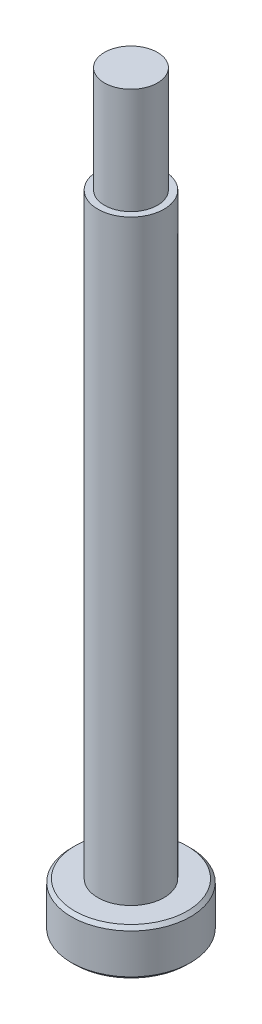
ISO-10303-21;
HEADER;
FILE_DESCRIPTION(('STEP AP214'),'2;1');
FILE_NAME('part.step','',(''),(''),'','','');
FILE_SCHEMA(('AUTOMOTIVE_DESIGN { 1 0 10303 214 1 1 1 1 }'));
ENDSEC;
DATA;
#1=APPLICATION_CONTEXT('core data for automotive mechanical design processes');
#2=APPLICATION_PROTOCOL_DEFINITION('international standard','automotive_design',2000,#1);
#3=PRODUCT_CONTEXT('',#1,'mechanical');
#4=PRODUCT('Part','Part','',(#3));
#5=PRODUCT_RELATED_PRODUCT_CATEGORY('part','',(#4));
#6=PRODUCT_DEFINITION_FORMATION('','',#4);
#7=PRODUCT_DEFINITION_CONTEXT('part definition',#1,'design');
#8=PRODUCT_DEFINITION('design','',#6,#7);
#9=PRODUCT_DEFINITION_SHAPE('','',#8);
#10=(LENGTH_UNIT() NAMED_UNIT(*) SI_UNIT(.MILLI.,.METRE.));
#11=(NAMED_UNIT(*) PLANE_ANGLE_UNIT() SI_UNIT($,.RADIAN.));
#12=(NAMED_UNIT(*) SI_UNIT($,.STERADIAN.) SOLID_ANGLE_UNIT());
#13=UNCERTAINTY_MEASURE_WITH_UNIT(LENGTH_MEASURE(1.E-05),#10,'distance_accuracy_value','');
#14=(GEOMETRIC_REPRESENTATION_CONTEXT(3) GLOBAL_UNCERTAINTY_ASSIGNED_CONTEXT((#13)) GLOBAL_UNIT_ASSIGNED_CONTEXT((#10,
#11,#12)) REPRESENTATION_CONTEXT('',''));
#15=CARTESIAN_POINT('',(0.,0.,0.));
#16=DIRECTION('',(0.,0.,1.));
#17=DIRECTION('',(1.,0.,0.));
#18=AXIS2_PLACEMENT_3D('',#15,#16,#17);
#19=CARTESIAN_POINT('',(0.,-3.5,0.));
#20=DIRECTION('',(0.,1.,0.));
#21=DIRECTION('',(0.,0.,1.));
#22=AXIS2_PLACEMENT_3D('',#19,#20,#21);
#23=CYLINDRICAL_SURFACE('',#22,4.5);
#24=CARTESIAN_POINT('',(0.,-0.249999999999998,0.));
#25=DIRECTION('',(0.,1.,0.));
#26=DIRECTION('',(0.,0.,1.));
#27=AXIS2_PLACEMENT_3D('',#24,#25,#26);
#28=CIRCLE('',#27,4.5);
#29=CARTESIAN_POINT('',(0.,-0.249999999999998,4.5));
#30=VERTEX_POINT('',#29);
#31=EDGE_CURVE('E57',#30,#30,#28,.F.);
#32=ORIENTED_EDGE('',*,*,#31,.T.);
#33=EDGE_LOOP('',(#32));
#34=FACE_BOUND('',#33,.T.);
#35=CARTESIAN_POINT('',(0.,-3.24999999999999,0.));
#36=DIRECTION('',(0.,1.,0.));
#37=DIRECTION('',(0.,0.,1.));
#38=AXIS2_PLACEMENT_3D('',#35,#36,#37);
#39=CIRCLE('',#38,4.5);
#40=CARTESIAN_POINT('',(0.,-3.24999999999999,4.5));
#41=VERTEX_POINT('',#40);
#42=EDGE_CURVE('E192',#41,#41,#39,.T.);
#43=ORIENTED_EDGE('',*,*,#42,.T.);
#44=EDGE_LOOP('',(#43));
#45=FACE_BOUND('',#44,.T.);
#46=ADVANCED_FACE('F47',(#34,#45),#23,.T.);
#47=CARTESIAN_POINT('',(0.,-3.5,0.));
#48=DIRECTION('',(0.,1.,0.));
#49=DIRECTION('',(0.,0.,1.));
#50=AXIS2_PLACEMENT_3D('',#47,#48,#49);
#51=PLANE('',#50);
#52=CARTESIAN_POINT('',(0.,-3.5,0.));
#53=DIRECTION('',(0.,1.,0.));
#54=DIRECTION('',(0.,0.,1.));
#55=AXIS2_PLACEMENT_3D('',#52,#53,#54);
#56=CIRCLE('',#55,4.24999999999998);
#57=CARTESIAN_POINT('',(0.,-3.5,4.24999999999998));
#58=VERTEX_POINT('',#57);
#59=EDGE_CURVE('E11',#58,#58,#56,.F.);
#60=ORIENTED_EDGE('',*,*,#59,.T.);
#61=EDGE_LOOP('',(#60));
#62=FACE_BOUND('',#61,.T.);
#63=DIRECTION('',(0.,0.,1.));
#64=VECTOR('',#63,1.);
#65=CARTESIAN_POINT('',(1.5,-3.5,-0.86602540378444));
#66=LINE('',#65,#64);
#67=CARTESIAN_POINT('',(1.5,-3.5,-0.86602540378444));
#68=VERTEX_POINT('',#67);
#69=CARTESIAN_POINT('',(1.5,-3.5,0.866025403784439));
#70=VERTEX_POINT('',#69);
#71=EDGE_CURVE('E144',#68,#70,#66,.T.);
#72=ORIENTED_EDGE('',*,*,#71,.F.);
#73=DIRECTION('',(0.866025403784439,0.,0.5));
#74=VECTOR('',#73,1.);
#75=CARTESIAN_POINT('',(0.,-3.5,-1.73205080756888));
#76=LINE('',#75,#74);
#77=CARTESIAN_POINT('',(0.,-3.5,-1.73205080756888));
#78=VERTEX_POINT('',#77);
#79=EDGE_CURVE('E64',#78,#68,#76,.T.);
#80=ORIENTED_EDGE('',*,*,#79,.F.);
#81=DIRECTION('',(0.866025403784439,0.,-0.5));
#82=VECTOR('',#81,1.);
#83=CARTESIAN_POINT('',(-1.5,-3.5,-0.866025403784439));
#84=LINE('',#83,#82);
#85=CARTESIAN_POINT('',(-1.5,-3.5,-0.866025403784439));
#86=VERTEX_POINT('',#85);
#87=EDGE_CURVE('E157',#86,#78,#84,.T.);
#88=ORIENTED_EDGE('',*,*,#87,.F.);
#89=DIRECTION('',(0.,0.,-1.));
#90=VECTOR('',#89,1.);
#91=CARTESIAN_POINT('',(-1.5,-3.5,0.866025403784439));
#92=LINE('',#91,#90);
#93=CARTESIAN_POINT('',(-1.5,-3.5,0.866025403784439));
#94=VERTEX_POINT('',#93);
#95=EDGE_CURVE('E154',#94,#86,#92,.T.);
#96=ORIENTED_EDGE('',*,*,#95,.F.);
#97=DIRECTION('',(-0.866025403784439,0.,-0.5));
#98=VECTOR('',#97,1.);
#99=CARTESIAN_POINT('',(0.,-3.5,1.73205080756888));
#100=LINE('',#99,#98);
#101=CARTESIAN_POINT('',(0.,-3.5,1.73205080756888));
#102=VERTEX_POINT('',#101);
#103=EDGE_CURVE('E112',#102,#94,#100,.T.);
#104=ORIENTED_EDGE('',*,*,#103,.F.);
#105=DIRECTION('',(-0.866025403784439,0.,0.5));
#106=VECTOR('',#105,1.);
#107=CARTESIAN_POINT('',(1.5,-3.5,0.866025403784439));
#108=LINE('',#107,#106);
#109=EDGE_CURVE('E148',#70,#102,#108,.T.);
#110=ORIENTED_EDGE('',*,*,#109,.F.);
#111=EDGE_LOOP('',(#72,#80,#88,#96,#104,#110));
#112=FACE_BOUND('',#111,.T.);
#113=ADVANCED_FACE('F210',(#62,#112),#51,.F.);
#114=CARTESIAN_POINT('',(0.,0.,0.));
#115=DIRECTION('',(0.,1.,0.));
#116=DIRECTION('',(0.,0.,1.));
#117=AXIS2_PLACEMENT_3D('',#114,#115,#116);
#118=PLANE('',#117);
#119=CARTESIAN_POINT('',(0.,0.,0.));
#120=DIRECTION('',(0.,1.,0.));
#121=DIRECTION('',(0.,0.,1.));
#122=AXIS2_PLACEMENT_3D('',#119,#120,#121);
#123=CIRCLE('',#122,4.25);
#124=CARTESIAN_POINT('',(0.,0.,4.25));
#125=VERTEX_POINT('',#124);
#126=EDGE_CURVE('E181',#125,#125,#123,.T.);
#127=ORIENTED_EDGE('',*,*,#126,.T.);
#128=EDGE_LOOP('',(#127));
#129=FACE_BOUND('',#128,.T.);
#130=CARTESIAN_POINT('',(0.,0.,0.));
#131=DIRECTION('',(0.,1.,0.));
#132=DIRECTION('',(0.,0.,1.));
#133=AXIS2_PLACEMENT_3D('',#130,#131,#132);
#134=CIRCLE('',#133,2.5);
#135=CARTESIAN_POINT('',(0.,0.,-2.5));
#136=VERTEX_POINT('',#135);
#137=EDGE_CURVE('E182',#136,#136,#134,.T.);
#138=ORIENTED_EDGE('',*,*,#137,.F.);
#139=EDGE_LOOP('',(#138));
#140=FACE_BOUND('',#139,.T.);
#141=ADVANCED_FACE('F206',(#129,#140),#118,.T.);
#142=CARTESIAN_POINT('',(0.,45.,0.));
#143=DIRECTION('',(0.,-1.,0.));
#144=DIRECTION('',(0.,0.,-1.));
#145=AXIS2_PLACEMENT_3D('',#142,#143,#144);
#146=CYLINDRICAL_SURFACE('',#145,2.5);
#147=CARTESIAN_POINT('',(0.,45.,0.));
#148=DIRECTION('',(0.,1.,0.));
#149=DIRECTION('',(0.,0.,1.));
#150=AXIS2_PLACEMENT_3D('',#147,#148,#149);
#151=CIRCLE('',#150,2.5);
#152=CARTESIAN_POINT('',(0.,45.,-2.5));
#153=VERTEX_POINT('',#152);
#154=EDGE_CURVE('E176',#153,#153,#151,.T.);
#155=CARTESIAN_POINT('',(0.,45.,-2.5));
#156=CARTESIAN_POINT('',(0.,44.53125,-2.5));
#157=CARTESIAN_POINT('',(0.,44.0625,-2.5));
#158=CARTESIAN_POINT('',(0.,43.125,-2.5));
#159=CARTESIAN_POINT('',(0.,42.65625,-2.5));
#160=CARTESIAN_POINT('',(0.,41.71875,-2.5));
#161=CARTESIAN_POINT('',(0.,41.25,-2.5));
#162=CARTESIAN_POINT('',(0.,40.3125,-2.5));
#163=CARTESIAN_POINT('',(0.,39.84375,-2.5));
#164=CARTESIAN_POINT('',(0.,38.90625,-2.5));
#165=CARTESIAN_POINT('',(0.,38.4375,-2.5));
#166=CARTESIAN_POINT('',(0.,37.5,-2.5));
#167=CARTESIAN_POINT('',(0.,37.03125,-2.5));
#168=CARTESIAN_POINT('',(0.,36.09375,-2.5));
#169=CARTESIAN_POINT('',(0.,35.625,-2.5));
#170=CARTESIAN_POINT('',(0.,34.6875,-2.5));
#171=CARTESIAN_POINT('',(0.,34.21875,-2.5));
#172=CARTESIAN_POINT('',(0.,33.28125,-2.5));
#173=CARTESIAN_POINT('',(0.,32.8125,-2.5));
#174=CARTESIAN_POINT('',(0.,31.875,-2.5));
#175=CARTESIAN_POINT('',(0.,31.40625,-2.5));
#176=CARTESIAN_POINT('',(0.,30.46875,-2.5));
#177=CARTESIAN_POINT('',(0.,30.,-2.5));
#178=CARTESIAN_POINT('',(0.,29.0625,-2.5));
#179=CARTESIAN_POINT('',(0.,28.59375,-2.5));
#180=CARTESIAN_POINT('',(0.,27.65625,-2.5));
#181=CARTESIAN_POINT('',(0.,27.1875,-2.5));
#182=CARTESIAN_POINT('',(0.,26.25,-2.5));
#183=CARTESIAN_POINT('',(0.,25.78125,-2.5));
#184=CARTESIAN_POINT('',(0.,24.84375,-2.5));
#185=CARTESIAN_POINT('',(0.,24.375,-2.5));
#186=CARTESIAN_POINT('',(0.,23.4375,-2.5));
#187=CARTESIAN_POINT('',(0.,22.96875,-2.5));
#188=CARTESIAN_POINT('',(0.,22.03125,-2.5));
#189=CARTESIAN_POINT('',(0.,21.5625,-2.5));
#190=CARTESIAN_POINT('',(0.,20.625,-2.5));
#191=CARTESIAN_POINT('',(0.,20.15625,-2.5));
#192=CARTESIAN_POINT('',(0.,19.21875,-2.5));
#193=CARTESIAN_POINT('',(0.,18.75,-2.5));
#194=CARTESIAN_POINT('',(0.,17.8125,-2.5));
#195=CARTESIAN_POINT('',(0.,17.34375,-2.5));
#196=CARTESIAN_POINT('',(0.,16.40625,-2.5));
#197=CARTESIAN_POINT('',(0.,15.9375,-2.5));
#198=CARTESIAN_POINT('',(0.,15.,-2.5));
#199=CARTESIAN_POINT('',(0.,14.53125,-2.5));
#200=CARTESIAN_POINT('',(0.,13.59375,-2.5));
#201=CARTESIAN_POINT('',(0.,13.125,-2.5));
#202=CARTESIAN_POINT('',(0.,12.1875,-2.5));
#203=CARTESIAN_POINT('',(0.,11.71875,-2.5));
#204=CARTESIAN_POINT('',(0.,10.78125,-2.5));
#205=CARTESIAN_POINT('',(0.,10.3125,-2.5));
#206=CARTESIAN_POINT('',(0.,9.37499999999999,-2.5));
#207=CARTESIAN_POINT('',(0.,8.90624999999999,-2.5));
#208=CARTESIAN_POINT('',(0.,7.96874999999999,-2.5));
#209=CARTESIAN_POINT('',(0.,7.5,-2.5));
#210=CARTESIAN_POINT('',(0.,6.56249999999999,-2.5));
#211=CARTESIAN_POINT('',(0.,6.09374999999999,-2.5));
#212=CARTESIAN_POINT('',(0.,5.15624999999999,-2.5));
#213=CARTESIAN_POINT('',(0.,4.68749999999999,-2.5));
#214=CARTESIAN_POINT('',(0.,3.74999999999999,-2.5));
#215=CARTESIAN_POINT('',(0.,3.28124999999999,-2.5));
#216=CARTESIAN_POINT('',(0.,2.34374999999999,-2.5));
#217=CARTESIAN_POINT('',(0.,1.87499999999999,-2.5));
#218=CARTESIAN_POINT('',(0.,0.937499999999992,-2.5));
#219=CARTESIAN_POINT('',(0.,0.468749999999993,-2.5));
#220=CARTESIAN_POINT('',(0.,0.,-2.5));
#221=B_SPLINE_CURVE_WITH_KNOTS('',3,(#155,#156,#157,#158,#159,#160,#161,#162,#163,#164,#165,
#166,#167,#168,#169,#170,#171,#172,#173,#174,#175,#176,#177,#178,#179,#180,#181,#182,#183,#184,
#185,#186,#187,#188,#189,#190,#191,#192,#193,#194,#195,#196,#197,#198,#199,#200,#201,#202,#203,
#204,#205,#206,#207,#208,#209,#210,#211,#212,#213,#214,#215,#216,#217,#218,#219,#220),
.UNSPECIFIED.,.F.,.F.,(4,2,2,2,2,2,2,2,2,2,2,2,2,2,2,2,2,2,2,2,2,2,2,2,2,2,2,2,2,2,2,2,4),(0.,
1.40625,2.8125,4.21874999999999,5.625,7.03125,8.43749999999999,9.84375,11.25,12.65625,14.0625,
15.46875,16.875,18.28125,19.6875,21.09375,22.5,23.90625,25.3125,26.71875,28.125,29.53125,
30.9375,32.34375,33.75,35.15625,36.5625,37.96875,39.375,40.78125,42.1875,43.59375,45.),.UNSPECIFIED.);
#222=EDGE_CURVE('BSEAM209',#153,#136,#221,.T.);
#223=ORIENTED_EDGE('',*,*,#154,.F.);
#224=ORIENTED_EDGE('',*,*,#137,.T.);
#225=ORIENTED_EDGE('',*,*,#222,.T.);
#226=ORIENTED_EDGE('',*,*,#222,.F.);
#227=EDGE_LOOP('',(#223,#225,#224,#226));
#228=FACE_BOUND('',#227,.T.);
#229=ADVANCED_FACE('F209',(#228),#146,.T.);
#230=CARTESIAN_POINT('',(0.,45.,0.));
#231=DIRECTION('',(0.,1.,0.));
#232=DIRECTION('',(0.,0.,1.));
#233=AXIS2_PLACEMENT_3D('',#230,#231,#232);
#234=PLANE('',#233);
#235=CARTESIAN_POINT('',(0.,45.,0.));
#236=DIRECTION('',(0.,1.,0.));
#237=DIRECTION('',(0.,0.,1.));
#238=AXIS2_PLACEMENT_3D('',#235,#236,#237);
#239=CIRCLE('',#238,2.);
#240=CARTESIAN_POINT('',(0.,45.,2.));
#241=VERTEX_POINT('',#240);
#242=EDGE_CURVE('E177',#241,#241,#239,.T.);
#243=ORIENTED_EDGE('',*,*,#242,.F.);
#244=EDGE_LOOP('',(#243));
#245=FACE_BOUND('',#244,.T.);
#246=ORIENTED_EDGE('',*,*,#154,.T.);
#247=EDGE_LOOP('',(#246));
#248=FACE_BOUND('',#247,.T.);
#249=ADVANCED_FACE('F215',(#245,#248),#234,.T.);
#250=CARTESIAN_POINT('',(0.,53.,0.));
#251=DIRECTION('',(0.,-1.,0.));
#252=DIRECTION('',(0.,0.,-1.));
#253=AXIS2_PLACEMENT_3D('',#250,#251,#252);
#254=CYLINDRICAL_SURFACE('',#253,2.);
#255=CARTESIAN_POINT('',(0.,53.,0.));
#256=DIRECTION('',(0.,1.,0.));
#257=DIRECTION('',(0.,0.,1.));
#258=AXIS2_PLACEMENT_3D('',#255,#256,#257);
#259=CIRCLE('',#258,2.);
#260=CARTESIAN_POINT('',(0.,53.,2.));
#261=VERTEX_POINT('',#260);
#262=EDGE_CURVE('E163',#261,#261,#259,.T.);
#263=ORIENTED_EDGE('',*,*,#262,.F.);
#264=EDGE_LOOP('',(#263));
#265=FACE_BOUND('',#264,.T.);
#266=ORIENTED_EDGE('',*,*,#242,.T.);
#267=EDGE_LOOP('',(#266));
#268=FACE_BOUND('',#267,.T.);
#269=ADVANCED_FACE('F221',(#265,#268),#254,.T.);
#270=CARTESIAN_POINT('',(0.,53.,0.));
#271=DIRECTION('',(0.,1.,0.));
#272=DIRECTION('',(0.,0.,1.));
#273=AXIS2_PLACEMENT_3D('',#270,#271,#272);
#274=PLANE('',#273);
#275=ORIENTED_EDGE('',*,*,#262,.T.);
#276=EDGE_LOOP('',(#275));
#277=FACE_BOUND('',#276,.T.);
#278=ADVANCED_FACE('F253',(#277),#274,.T.);
#279=CARTESIAN_POINT('',(0.,-1.,-1.73205080756888));
#280=DIRECTION('',(0.5,0.,-0.866025403784439));
#281=DIRECTION('',(-0.866025403784439,0.,-0.5));
#282=AXIS2_PLACEMENT_3D('',#279,#280,#281);
#283=PLANE('',#282);
#284=ORIENTED_EDGE('',*,*,#79,.T.);
#285=DIRECTION('',(0.,-1.,0.));
#286=VECTOR('',#285,1.);
#287=CARTESIAN_POINT('',(1.5,-1.,-0.86602540378444));
#288=LINE('',#287,#286);
#289=CARTESIAN_POINT('',(1.5,-1.,-0.86602540378444));
#290=VERTEX_POINT('',#289);
#291=EDGE_CURVE('E94',#290,#68,#288,.T.);
#292=ORIENTED_EDGE('',*,*,#291,.F.);
#293=DIRECTION('',(0.866025403784439,0.,0.5));
#294=VECTOR('',#293,1.);
#295=CARTESIAN_POINT('',(0.,-1.,-1.73205080756888));
#296=LINE('',#295,#294);
#297=CARTESIAN_POINT('',(0.,-1.,-1.73205080756888));
#298=VERTEX_POINT('',#297);
#299=EDGE_CURVE('E160',#298,#290,#296,.T.);
#300=ORIENTED_EDGE('',*,*,#299,.F.);
#301=DIRECTION('',(0.,-1.,0.));
#302=VECTOR('',#301,1.);
#303=CARTESIAN_POINT('',(0.,-1.,-1.73205080756888));
#304=LINE('',#303,#302);
#305=EDGE_CURVE('E72',#298,#78,#304,.T.);
#306=ORIENTED_EDGE('',*,*,#305,.T.);
#307=EDGE_LOOP('',(#284,#292,#300,#306));
#308=FACE_BOUND('',#307,.T.);
#309=ADVANCED_FACE('F250',(#308),#283,.F.);
#310=CARTESIAN_POINT('',(-1.5,-1.,-0.866025403784439));
#311=DIRECTION('',(-0.5,0.,-0.866025403784439));
#312=DIRECTION('',(-0.866025403784439,0.,0.5));
#313=AXIS2_PLACEMENT_3D('',#310,#311,#312);
#314=PLANE('',#313);
#315=ORIENTED_EDGE('',*,*,#87,.T.);
#316=ORIENTED_EDGE('',*,*,#305,.F.);
#317=DIRECTION('',(0.866025403784439,0.,-0.5));
#318=VECTOR('',#317,1.);
#319=CARTESIAN_POINT('',(-1.5,-1.,-0.866025403784439));
#320=LINE('',#319,#318);
#321=CARTESIAN_POINT('',(-1.5,-1.,-0.866025403784439));
#322=VERTEX_POINT('',#321);
#323=EDGE_CURVE('E126',#322,#298,#320,.T.);
#324=ORIENTED_EDGE('',*,*,#323,.F.);
#325=DIRECTION('',(0.,-1.,0.));
#326=VECTOR('',#325,1.);
#327=CARTESIAN_POINT('',(-1.5,-1.,-0.866025403784439));
#328=LINE('',#327,#326);
#329=EDGE_CURVE('E117',#322,#86,#328,.T.);
#330=ORIENTED_EDGE('',*,*,#329,.T.);
#331=EDGE_LOOP('',(#315,#316,#324,#330));
#332=FACE_BOUND('',#331,.T.);
#333=ADVANCED_FACE('F252',(#332),#314,.F.);
#334=CARTESIAN_POINT('',(-1.5,-1.,0.866025403784439));
#335=DIRECTION('',(-1.,0.,0.));
#336=DIRECTION('',(0.,0.,1.));
#337=AXIS2_PLACEMENT_3D('',#334,#335,#336);
#338=PLANE('',#337);
#339=ORIENTED_EDGE('',*,*,#95,.T.);
#340=ORIENTED_EDGE('',*,*,#329,.F.);
#341=DIRECTION('',(0.,0.,-1.));
#342=VECTOR('',#341,1.);
#343=CARTESIAN_POINT('',(-1.5,-1.,0.866025403784439));
#344=LINE('',#343,#342);
#345=CARTESIAN_POINT('',(-1.5,-1.,0.866025403784439));
#346=VERTEX_POINT('',#345);
#347=EDGE_CURVE('E121',#346,#322,#344,.T.);
#348=ORIENTED_EDGE('',*,*,#347,.F.);
#349=DIRECTION('',(0.,-1.,0.));
#350=VECTOR('',#349,1.);
#351=CARTESIAN_POINT('',(-1.5,-1.,0.866025403784439));
#352=LINE('',#351,#350);
#353=EDGE_CURVE('E105',#346,#94,#352,.T.);
#354=ORIENTED_EDGE('',*,*,#353,.T.);
#355=EDGE_LOOP('',(#339,#340,#348,#354));
#356=FACE_BOUND('',#355,.T.);
#357=ADVANCED_FACE('F122',(#356),#338,.F.);
#358=CARTESIAN_POINT('',(0.,-1.,1.73205080756888));
#359=DIRECTION('',(-0.5,0.,0.866025403784439));
#360=DIRECTION('',(0.866025403784439,0.,0.5));
#361=AXIS2_PLACEMENT_3D('',#358,#359,#360);
#362=PLANE('',#361);
#363=ORIENTED_EDGE('',*,*,#103,.T.);
#364=ORIENTED_EDGE('',*,*,#353,.F.);
#365=DIRECTION('',(-0.866025403784439,0.,-0.5));
#366=VECTOR('',#365,1.);
#367=CARTESIAN_POINT('',(0.,-1.,1.73205080756888));
#368=LINE('',#367,#366);
#369=CARTESIAN_POINT('',(0.,-1.,1.73205080756888));
#370=VERTEX_POINT('',#369);
#371=EDGE_CURVE('E109',#370,#346,#368,.T.);
#372=ORIENTED_EDGE('',*,*,#371,.F.);
#373=DIRECTION('',(0.,-1.,0.));
#374=VECTOR('',#373,1.);
#375=CARTESIAN_POINT('',(0.,-1.,1.73205080756888));
#376=LINE('',#375,#374);
#377=EDGE_CURVE('E118',#370,#102,#376,.T.);
#378=ORIENTED_EDGE('',*,*,#377,.T.);
#379=EDGE_LOOP('',(#363,#364,#372,#378));
#380=FACE_BOUND('',#379,.T.);
#381=ADVANCED_FACE('F107',(#380),#362,.F.);
#382=CARTESIAN_POINT('',(1.5,-1.,0.866025403784439));
#383=DIRECTION('',(0.5,0.,0.866025403784439));
#384=DIRECTION('',(0.866025403784439,0.,-0.5));
#385=AXIS2_PLACEMENT_3D('',#382,#383,#384);
#386=PLANE('',#385);
#387=ORIENTED_EDGE('',*,*,#109,.T.);
#388=ORIENTED_EDGE('',*,*,#377,.F.);
#389=DIRECTION('',(-0.866025403784439,0.,0.5));
#390=VECTOR('',#389,1.);
#391=CARTESIAN_POINT('',(1.5,-1.,0.866025403784439));
#392=LINE('',#391,#390);
#393=CARTESIAN_POINT('',(1.5,-1.,0.866025403784439));
#394=VERTEX_POINT('',#393);
#395=EDGE_CURVE('E132',#394,#370,#392,.T.);
#396=ORIENTED_EDGE('',*,*,#395,.F.);
#397=DIRECTION('',(0.,-1.,0.));
#398=VECTOR('',#397,1.);
#399=CARTESIAN_POINT('',(1.5,-1.,0.866025403784439));
#400=LINE('',#399,#398);
#401=EDGE_CURVE('E168',#394,#70,#400,.T.);
#402=ORIENTED_EDGE('',*,*,#401,.T.);
#403=EDGE_LOOP('',(#387,#388,#396,#402));
#404=FACE_BOUND('',#403,.T.);
#405=ADVANCED_FACE('F308',(#404),#386,.F.);
#406=CARTESIAN_POINT('',(1.5,-1.,-0.86602540378444));
#407=DIRECTION('',(1.,0.,0.));
#408=DIRECTION('',(0.,0.,-1.));
#409=AXIS2_PLACEMENT_3D('',#406,#407,#408);
#410=PLANE('',#409);
#411=ORIENTED_EDGE('',*,*,#71,.T.);
#412=ORIENTED_EDGE('',*,*,#401,.F.);
#413=DIRECTION('',(0.,0.,1.));
#414=VECTOR('',#413,1.);
#415=CARTESIAN_POINT('',(1.5,-1.,-0.86602540378444));
#416=LINE('',#415,#414);
#417=EDGE_CURVE('E136',#290,#394,#416,.T.);
#418=ORIENTED_EDGE('',*,*,#417,.F.);
#419=ORIENTED_EDGE('',*,*,#291,.T.);
#420=EDGE_LOOP('',(#411,#412,#418,#419));
#421=FACE_BOUND('',#420,.T.);
#422=ADVANCED_FACE('F246',(#421),#410,.F.);
#423=CARTESIAN_POINT('',(0.,-1.,0.));
#424=DIRECTION('',(0.,-1.,0.));
#425=DIRECTION('',(0.,0.,-1.));
#426=AXIS2_PLACEMENT_3D('',#423,#424,#425);
#427=PLANE('',#426);
#428=ORIENTED_EDGE('',*,*,#299,.T.);
#429=ORIENTED_EDGE('',*,*,#417,.T.);
#430=ORIENTED_EDGE('',*,*,#395,.T.);
#431=ORIENTED_EDGE('',*,*,#371,.T.);
#432=ORIENTED_EDGE('',*,*,#347,.T.);
#433=ORIENTED_EDGE('',*,*,#323,.T.);
#434=EDGE_LOOP('',(#428,#429,#430,#431,#432,#433));
#435=FACE_BOUND('',#434,.T.);
#436=ADVANCED_FACE('F129',(#435),#427,.T.);
#437=CARTESIAN_POINT('',(0.,0.,0.));
#438=DIRECTION('',(0.,-1.,0.));
#439=DIRECTION('',(0.,0.,-1.));
#440=AXIS2_PLACEMENT_3D('',#437,#438,#439);
#441=CONICAL_SURFACE('',#440,4.25,0.785398163397445);
#442=ORIENTED_EDGE('',*,*,#31,.F.);
#443=EDGE_LOOP('',(#442));
#444=FACE_BOUND('',#443,.T.);
#445=ORIENTED_EDGE('',*,*,#126,.F.);
#446=EDGE_LOOP('',(#445));
#447=FACE_BOUND('',#446,.T.);
#448=ADVANCED_FACE('F201',(#444,#447),#441,.T.);
#449=CARTESIAN_POINT('',(0.,-3.24999999999999,0.));
#450=DIRECTION('',(0.,1.,0.));
#451=DIRECTION('',(0.,0.,1.));
#452=AXIS2_PLACEMENT_3D('',#449,#450,#451);
#453=CONICAL_SURFACE('',#452,4.5,0.785398163397466);
#454=ORIENTED_EDGE('',*,*,#59,.F.);
#455=EDGE_LOOP('',(#454));
#456=FACE_BOUND('',#455,.T.);
#457=ORIENTED_EDGE('',*,*,#42,.F.);
#458=EDGE_LOOP('',(#457));
#459=FACE_BOUND('',#458,.T.);
#460=ADVANCED_FACE('F50',(#456,#459),#453,.T.);
#461=CLOSED_SHELL('',(#46,#113,#141,#229,#249,#269,#278,#309,#333,#357,#381,#405,#422,#436,#448,#460));
#462=MANIFOLD_SOLID_BREP('B2',#461);
#463=ADVANCED_BREP_SHAPE_REPRESENTATION('',(#18,#462),#14);
#464=SHAPE_DEFINITION_REPRESENTATION(#9,#463);
ENDSEC;
END-ISO-10303-21;
